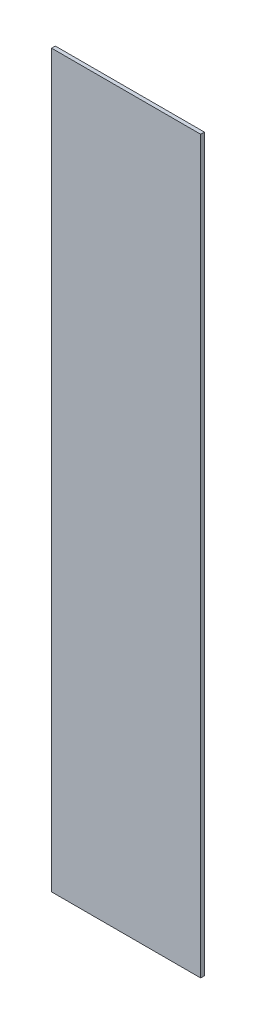
ISO-10303-21;
HEADER;
FILE_DESCRIPTION(('STEP AP214'),'2;1');
FILE_NAME('part.step','',(''),(''),'','','');
FILE_SCHEMA(('AUTOMOTIVE_DESIGN { 1 0 10303 214 1 1 1 1 }'));
ENDSEC;
DATA;
#1=APPLICATION_CONTEXT('core data for automotive mechanical design processes');
#2=APPLICATION_PROTOCOL_DEFINITION('international standard','automotive_design',2000,#1);
#3=PRODUCT_CONTEXT('',#1,'mechanical');
#4=PRODUCT('Part','Part','',(#3));
#5=PRODUCT_RELATED_PRODUCT_CATEGORY('part','',(#4));
#6=PRODUCT_DEFINITION_FORMATION('','',#4);
#7=PRODUCT_DEFINITION_CONTEXT('part definition',#1,'design');
#8=PRODUCT_DEFINITION('design','',#6,#7);
#9=PRODUCT_DEFINITION_SHAPE('','',#8);
#10=(LENGTH_UNIT() NAMED_UNIT(*) SI_UNIT(.MILLI.,.METRE.));
#11=(NAMED_UNIT(*) PLANE_ANGLE_UNIT() SI_UNIT($,.RADIAN.));
#12=(NAMED_UNIT(*) SI_UNIT($,.STERADIAN.) SOLID_ANGLE_UNIT());
#13=UNCERTAINTY_MEASURE_WITH_UNIT(LENGTH_MEASURE(1.E-05),#10,'distance_accuracy_value','');
#14=(GEOMETRIC_REPRESENTATION_CONTEXT(3) GLOBAL_UNCERTAINTY_ASSIGNED_CONTEXT((#13)) GLOBAL_UNIT_ASSIGNED_CONTEXT((#10,
#11,#12)) REPRESENTATION_CONTEXT('',''));
#15=CARTESIAN_POINT('',(0.,0.,0.));
#16=DIRECTION('',(0.,0.,1.));
#17=DIRECTION('',(1.,0.,0.));
#18=AXIS2_PLACEMENT_3D('',#15,#16,#17);
#19=CARTESIAN_POINT('',(10.,-49.,0.5));
#20=DIRECTION('',(-1.,0.,0.));
#21=DIRECTION('',(0.,0.,1.));
#22=AXIS2_PLACEMENT_3D('',#19,#20,#21);
#23=PLANE('',#22);
#24=DIRECTION('',(0.,1.,0.));
#25=VECTOR('',#24,1.);
#26=CARTESIAN_POINT('',(10.,-49.,0.));
#27=LINE('',#26,#25);
#28=CARTESIAN_POINT('',(10.,-49.,0.));
#29=VERTEX_POINT('',#28);
#30=CARTESIAN_POINT('',(10.,49.,0.));
#31=VERTEX_POINT('',#30);
#32=EDGE_CURVE('E96',#29,#31,#27,.T.);
#33=ORIENTED_EDGE('',*,*,#32,.T.);
#34=DIRECTION('',(0.,0.,-1.));
#35=VECTOR('',#34,1.);
#36=CARTESIAN_POINT('',(10.,49.,0.5));
#37=LINE('',#36,#35);
#38=CARTESIAN_POINT('',(10.,49.,0.5));
#39=VERTEX_POINT('',#38);
#40=EDGE_CURVE('E11',#39,#31,#37,.T.);
#41=ORIENTED_EDGE('',*,*,#40,.F.);
#42=DIRECTION('',(0.,1.,0.));
#43=VECTOR('',#42,1.);
#44=CARTESIAN_POINT('',(10.,-49.,0.5));
#45=LINE('',#44,#43);
#46=CARTESIAN_POINT('',(10.,-49.,0.5));
#47=VERTEX_POINT('',#46);
#48=EDGE_CURVE('E84',#47,#39,#45,.T.);
#49=ORIENTED_EDGE('',*,*,#48,.F.);
#50=DIRECTION('',(0.,0.,-1.));
#51=VECTOR('',#50,1.);
#52=CARTESIAN_POINT('',(10.,-49.,0.5));
#53=LINE('',#52,#51);
#54=EDGE_CURVE('E92',#47,#29,#53,.T.);
#55=ORIENTED_EDGE('',*,*,#54,.T.);
#56=EDGE_LOOP('',(#33,#41,#49,#55));
#57=FACE_BOUND('',#56,.T.);
#58=ADVANCED_FACE('F33',(#57),#23,.F.);
#59=CARTESIAN_POINT('',(-10.,49.,0.5));
#60=DIRECTION('',(0.,-1.,0.));
#61=DIRECTION('',(0.,0.,-1.));
#62=AXIS2_PLACEMENT_3D('',#59,#60,#61);
#63=PLANE('',#62);
#64=DIRECTION('',(-1.,0.,0.));
#65=VECTOR('',#64,1.);
#66=CARTESIAN_POINT('',(-10.,49.,0.));
#67=LINE('',#66,#65);
#68=CARTESIAN_POINT('',(-10.,49.,0.));
#69=VERTEX_POINT('',#68);
#70=EDGE_CURVE('E88',#31,#69,#67,.T.);
#71=ORIENTED_EDGE('',*,*,#70,.T.);
#72=DIRECTION('',(0.,0.,-1.));
#73=VECTOR('',#72,1.);
#74=CARTESIAN_POINT('',(-10.,49.,0.5));
#75=LINE('',#74,#73);
#76=CARTESIAN_POINT('',(-10.,49.,0.5));
#77=VERTEX_POINT('',#76);
#78=EDGE_CURVE('E41',#77,#69,#75,.T.);
#79=ORIENTED_EDGE('',*,*,#78,.F.);
#80=DIRECTION('',(-1.,0.,0.));
#81=VECTOR('',#80,1.);
#82=CARTESIAN_POINT('',(-10.,49.,0.5));
#83=LINE('',#82,#81);
#84=EDGE_CURVE('E79',#39,#77,#83,.T.);
#85=ORIENTED_EDGE('',*,*,#84,.F.);
#86=ORIENTED_EDGE('',*,*,#40,.T.);
#87=EDGE_LOOP('',(#71,#79,#85,#86));
#88=FACE_BOUND('',#87,.T.);
#89=ADVANCED_FACE('F87',(#88),#63,.F.);
#90=CARTESIAN_POINT('',(-10.,-49.,0.5));
#91=DIRECTION('',(1.,0.,0.));
#92=DIRECTION('',(0.,0.,-1.));
#93=AXIS2_PLACEMENT_3D('',#90,#91,#92);
#94=PLANE('',#93);
#95=DIRECTION('',(0.,-1.,0.));
#96=VECTOR('',#95,1.);
#97=CARTESIAN_POINT('',(-10.,-49.,0.));
#98=LINE('',#97,#96);
#99=CARTESIAN_POINT('',(-10.,-49.,0.));
#100=VERTEX_POINT('',#99);
#101=EDGE_CURVE('E66',#69,#100,#98,.T.);
#102=ORIENTED_EDGE('',*,*,#101,.T.);
#103=DIRECTION('',(0.,0.,-1.));
#104=VECTOR('',#103,1.);
#105=CARTESIAN_POINT('',(-10.,-49.,0.5));
#106=LINE('',#105,#104);
#107=CARTESIAN_POINT('',(-10.,-49.,0.5));
#108=VERTEX_POINT('',#107);
#109=EDGE_CURVE('E89',#108,#100,#106,.T.);
#110=ORIENTED_EDGE('',*,*,#109,.F.);
#111=DIRECTION('',(0.,-1.,0.));
#112=VECTOR('',#111,1.);
#113=CARTESIAN_POINT('',(-10.,-49.,0.5));
#114=LINE('',#113,#112);
#115=EDGE_CURVE('E82',#77,#108,#114,.T.);
#116=ORIENTED_EDGE('',*,*,#115,.F.);
#117=ORIENTED_EDGE('',*,*,#78,.T.);
#118=EDGE_LOOP('',(#102,#110,#116,#117));
#119=FACE_BOUND('',#118,.T.);
#120=ADVANCED_FACE('F90',(#119),#94,.F.);
#121=CARTESIAN_POINT('',(-10.,-49.,0.5));
#122=DIRECTION('',(0.,1.,0.));
#123=DIRECTION('',(0.,0.,1.));
#124=AXIS2_PLACEMENT_3D('',#121,#122,#123);
#125=PLANE('',#124);
#126=DIRECTION('',(1.,0.,0.));
#127=VECTOR('',#126,1.);
#128=CARTESIAN_POINT('',(-10.,-49.,0.));
#129=LINE('',#128,#127);
#130=EDGE_CURVE('E72',#100,#29,#129,.T.);
#131=ORIENTED_EDGE('',*,*,#130,.T.);
#132=ORIENTED_EDGE('',*,*,#54,.F.);
#133=DIRECTION('',(1.,0.,0.));
#134=VECTOR('',#133,1.);
#135=CARTESIAN_POINT('',(-10.,-49.,0.5));
#136=LINE('',#135,#134);
#137=EDGE_CURVE('E49',#108,#47,#136,.T.);
#138=ORIENTED_EDGE('',*,*,#137,.F.);
#139=ORIENTED_EDGE('',*,*,#109,.T.);
#140=EDGE_LOOP('',(#131,#132,#138,#139));
#141=FACE_BOUND('',#140,.T.);
#142=ADVANCED_FACE('F103',(#141),#125,.F.);
#143=CARTESIAN_POINT('',(0.,0.,0.5));
#144=DIRECTION('',(0.,0.,-1.));
#145=DIRECTION('',(-1.,0.,0.));
#146=AXIS2_PLACEMENT_3D('',#143,#144,#145);
#147=PLANE('',#146);
#148=ORIENTED_EDGE('',*,*,#48,.T.);
#149=ORIENTED_EDGE('',*,*,#84,.T.);
#150=ORIENTED_EDGE('',*,*,#115,.T.);
#151=ORIENTED_EDGE('',*,*,#137,.T.);
#152=EDGE_LOOP('',(#148,#149,#150,#151));
#153=FACE_BOUND('',#152,.T.);
#154=ADVANCED_FACE('F80',(#153),#147,.F.);
#155=CARTESIAN_POINT('',(0.,0.,0.));
#156=DIRECTION('',(0.,0.,-1.));
#157=DIRECTION('',(-1.,0.,0.));
#158=AXIS2_PLACEMENT_3D('',#155,#156,#157);
#159=PLANE('',#158);
#160=ORIENTED_EDGE('',*,*,#32,.F.);
#161=ORIENTED_EDGE('',*,*,#130,.F.);
#162=ORIENTED_EDGE('',*,*,#101,.F.);
#163=ORIENTED_EDGE('',*,*,#70,.F.);
#164=EDGE_LOOP('',(#160,#161,#162,#163));
#165=FACE_BOUND('',#164,.T.);
#166=ADVANCED_FACE('F106',(#165),#159,.T.);
#167=CLOSED_SHELL('',(#58,#89,#120,#142,#154,#166));
#168=MANIFOLD_SOLID_BREP('B2',#167);
#169=ADVANCED_BREP_SHAPE_REPRESENTATION('',(#18,#168),#14);
#170=SHAPE_DEFINITION_REPRESENTATION(#9,#169);
ENDSEC;
END-ISO-10303-21;
